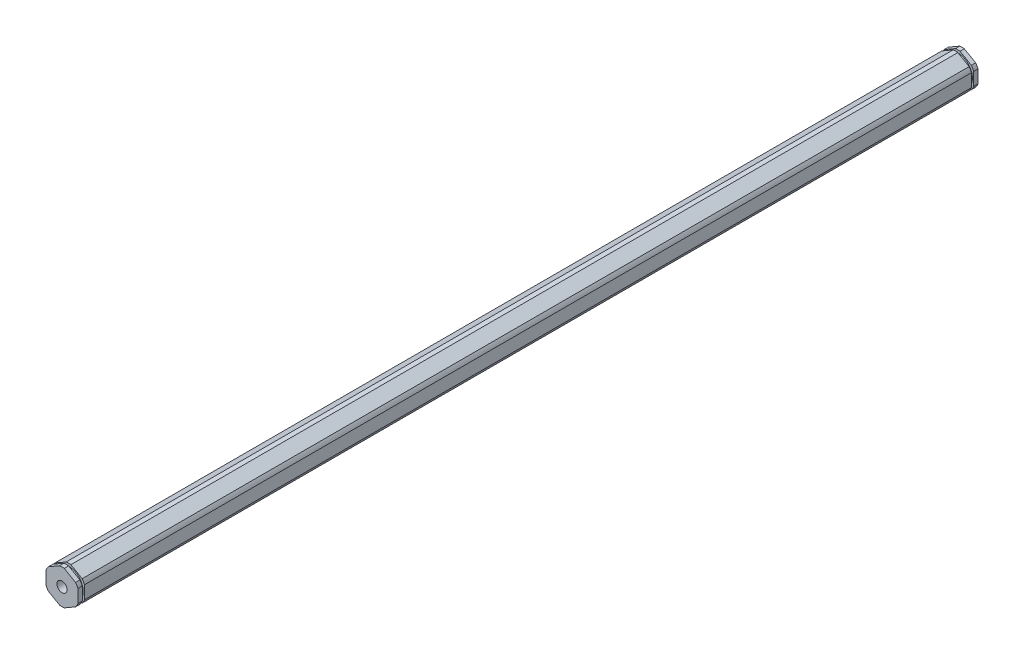
ISO-10303-21;
HEADER;
FILE_DESCRIPTION(('STEP AP214'),'2;1');
FILE_NAME('part.step','',(''),(''),'','','');
FILE_SCHEMA(('AUTOMOTIVE_DESIGN { 1 0 10303 214 1 1 1 1 }'));
ENDSEC;
DATA;
#1=APPLICATION_CONTEXT('core data for automotive mechanical design processes');
#2=APPLICATION_PROTOCOL_DEFINITION('international standard','automotive_design',2000,#1);
#3=PRODUCT_CONTEXT('',#1,'mechanical');
#4=PRODUCT('Part','Part','',(#3));
#5=PRODUCT_RELATED_PRODUCT_CATEGORY('part','',(#4));
#6=PRODUCT_DEFINITION_FORMATION('','',#4);
#7=PRODUCT_DEFINITION_CONTEXT('part definition',#1,'design');
#8=PRODUCT_DEFINITION('design','',#6,#7);
#9=PRODUCT_DEFINITION_SHAPE('','',#8);
#10=(LENGTH_UNIT() NAMED_UNIT(*) SI_UNIT(.MILLI.,.METRE.));
#11=(NAMED_UNIT(*) PLANE_ANGLE_UNIT() SI_UNIT($,.RADIAN.));
#12=(NAMED_UNIT(*) SI_UNIT($,.STERADIAN.) SOLID_ANGLE_UNIT());
#13=UNCERTAINTY_MEASURE_WITH_UNIT(LENGTH_MEASURE(1.E-05),#10,'distance_accuracy_value','');
#14=(GEOMETRIC_REPRESENTATION_CONTEXT(3) GLOBAL_UNCERTAINTY_ASSIGNED_CONTEXT((#13)) GLOBAL_UNIT_ASSIGNED_CONTEXT((#10,
#11,#12)) REPRESENTATION_CONTEXT('',''));
#15=CARTESIAN_POINT('',(0.,0.,0.));
#16=DIRECTION('',(0.,0.,1.));
#17=DIRECTION('',(1.,0.,0.));
#18=AXIS2_PLACEMENT_3D('',#15,#16,#17);
#19=CARTESIAN_POINT('',(0.,0.,178.8795));
#20=DIRECTION('',(0.,0.,-1.));
#21=DIRECTION('',(-1.,0.,0.));
#22=AXIS2_PLACEMENT_3D('',#19,#20,#21);
#23=CYLINDRICAL_SURFACE('',#22,6.858);
#24=CARTESIAN_POINT('',(0.,0.,-176.276));
#25=DIRECTION('',(0.,0.,1.));
#26=DIRECTION('',(1.,0.,0.));
#27=AXIS2_PLACEMENT_3D('',#24,#25,#26);
#28=CIRCLE('',#27,6.858);
#29=CARTESIAN_POINT('',(5.41826726004727,-4.20411035757862,-176.276));
#30=VERTEX_POINT('',#29);
#31=CARTESIAN_POINT('',(6.35,-2.59030191290513,-176.276));
#32=VERTEX_POINT('',#31);
#33=EDGE_CURVE('E323',#30,#32,#28,.T.);
#34=ORIENTED_EDGE('',*,*,#33,.T.);
#35=DIRECTION('',(0.,0.,-1.));
#36=VECTOR('',#35,1.);
#37=CARTESIAN_POINT('',(6.35,-2.59030191290513,178.8795));
#38=LINE('',#37,#36);
#39=CARTESIAN_POINT('',(6.35,-2.59030191290513,176.276));
#40=VERTEX_POINT('',#39);
#41=EDGE_CURVE('E369',#40,#32,#38,.T.);
#42=ORIENTED_EDGE('',*,*,#41,.F.);
#43=CARTESIAN_POINT('',(0.,0.,176.276));
#44=DIRECTION('',(0.,0.,1.));
#45=DIRECTION('',(1.,0.,0.));
#46=AXIS2_PLACEMENT_3D('',#43,#44,#45);
#47=CIRCLE('',#46,6.858);
#48=CARTESIAN_POINT('',(5.41826726004727,-4.20411035757862,176.276));
#49=VERTEX_POINT('',#48);
#50=EDGE_CURVE('E345',#49,#40,#47,.T.);
#51=ORIENTED_EDGE('',*,*,#50,.F.);
#52=DIRECTION('',(0.,0.,-1.));
#53=VECTOR('',#52,1.);
#54=CARTESIAN_POINT('',(5.41826726004727,-4.20411035757862,178.8795));
#55=LINE('',#54,#53);
#56=EDGE_CURVE('E371',#49,#30,#55,.T.);
#57=ORIENTED_EDGE('',*,*,#56,.T.);
#58=EDGE_LOOP('',(#34,#42,#51,#57));
#59=FACE_BOUND('',#58,.T.);
#60=ADVANCED_FACE('F72',(#59),#23,.T.);
#61=CARTESIAN_POINT('',(3.175,-5.49926131403118,178.8795));
#62=DIRECTION('',(-0.5,0.866025403784439,0.));
#63=DIRECTION('',(-0.866025403784439,-0.5,0.));
#64=AXIS2_PLACEMENT_3D('',#61,#62,#63);
#65=PLANE('',#64);
#66=DIRECTION('',(-0.866025403784439,-0.5,0.));
#67=VECTOR('',#66,1.);
#68=CARTESIAN_POINT('',(3.175,-5.49926131403118,-176.276));
#69=LINE('',#68,#67);
#70=CARTESIAN_POINT('',(0.931732739952731,-6.79441227048375,-176.276));
#71=VERTEX_POINT('',#70);
#72=EDGE_CURVE('E641',#30,#71,#69,.T.);
#73=ORIENTED_EDGE('',*,*,#72,.F.);
#74=ORIENTED_EDGE('',*,*,#56,.F.);
#75=DIRECTION('',(0.866025403784439,0.5,0.));
#76=VECTOR('',#75,1.);
#77=CARTESIAN_POINT('',(3.175,-5.49926131403118,176.276));
#78=LINE('',#77,#76);
#79=CARTESIAN_POINT('',(0.931732739952728,-6.79441227048375,176.276));
#80=VERTEX_POINT('',#79);
#81=EDGE_CURVE('E605',#80,#49,#78,.T.);
#82=ORIENTED_EDGE('',*,*,#81,.F.);
#83=DIRECTION('',(0.,0.,-1.));
#84=VECTOR('',#83,1.);
#85=CARTESIAN_POINT('',(0.931732739952731,-6.79441227048375,178.8795));
#86=LINE('',#85,#84);
#87=EDGE_CURVE('E401',#80,#71,#86,.T.);
#88=ORIENTED_EDGE('',*,*,#87,.T.);
#89=EDGE_LOOP('',(#73,#74,#82,#88));
#90=FACE_BOUND('',#89,.T.);
#91=ADVANCED_FACE('F704',(#90),#65,.F.);
#92=CARTESIAN_POINT('',(-0.931732739952719,-6.79441227048375,-176.276));
#93=VERTEX_POINT('',#92);
#94=EDGE_CURVE('E373',#93,#71,#28,.T.);
#95=ORIENTED_EDGE('',*,*,#94,.T.);
#96=ORIENTED_EDGE('',*,*,#87,.F.);
#97=CARTESIAN_POINT('',(0.,0.,176.276));
#98=DIRECTION('',(0.,0.,1.));
#99=DIRECTION('',(1.,0.,0.));
#100=AXIS2_PLACEMENT_3D('',#97,#98,#99);
#101=CIRCLE('',#100,6.858);
#102=CARTESIAN_POINT('',(-0.931732739952721,-6.79441227048375,176.276));
#103=VERTEX_POINT('',#102);
#104=EDGE_CURVE('E620',#103,#80,#101,.T.);
#105=ORIENTED_EDGE('',*,*,#104,.F.);
#106=DIRECTION('',(0.,0.,-1.));
#107=VECTOR('',#106,1.);
#108=CARTESIAN_POINT('',(-0.931732739952721,-6.79441227048375,178.8795));
#109=LINE('',#108,#107);
#110=EDGE_CURVE('E407',#103,#93,#109,.T.);
#111=ORIENTED_EDGE('',*,*,#110,.T.);
#112=EDGE_LOOP('',(#95,#96,#105,#111));
#113=FACE_BOUND('',#112,.T.);
#114=ADVANCED_FACE('F698',(#113),#23,.T.);
#115=CARTESIAN_POINT('',(-3.175,-5.49926131403118,178.8795));
#116=DIRECTION('',(0.5,0.866025403784439,0.));
#117=DIRECTION('',(-0.866025403784439,0.5,0.));
#118=AXIS2_PLACEMENT_3D('',#115,#116,#117);
#119=PLANE('',#118);
#120=DIRECTION('',(-0.866025403784439,0.5,0.));
#121=VECTOR('',#120,1.);
#122=CARTESIAN_POINT('',(-3.175,-5.49926131403118,-176.276));
#123=LINE('',#122,#121);
#124=CARTESIAN_POINT('',(-5.41826726004728,-4.20411035757862,-176.276));
#125=VERTEX_POINT('',#124);
#126=EDGE_CURVE('E644',#93,#125,#123,.T.);
#127=ORIENTED_EDGE('',*,*,#126,.F.);
#128=ORIENTED_EDGE('',*,*,#110,.F.);
#129=DIRECTION('',(0.866025403784439,-0.5,0.));
#130=VECTOR('',#129,1.);
#131=CARTESIAN_POINT('',(-3.175,-5.49926131403118,176.276));
#132=LINE('',#131,#130);
#133=CARTESIAN_POINT('',(-5.41826726004728,-4.20411035757861,176.276));
#134=VERTEX_POINT('',#133);
#135=EDGE_CURVE('E602',#134,#103,#132,.T.);
#136=ORIENTED_EDGE('',*,*,#135,.F.);
#137=DIRECTION('',(0.,0.,-1.));
#138=VECTOR('',#137,1.);
#139=CARTESIAN_POINT('',(-5.41826726004728,-4.20411035757862,178.8795));
#140=LINE('',#139,#138);
#141=EDGE_CURVE('E413',#134,#125,#140,.T.);
#142=ORIENTED_EDGE('',*,*,#141,.T.);
#143=EDGE_LOOP('',(#127,#128,#136,#142));
#144=FACE_BOUND('',#143,.T.);
#145=ADVANCED_FACE('F816',(#144),#119,.F.);
#146=CARTESIAN_POINT('',(-6.35,-2.59030191290514,-176.276));
#147=VERTEX_POINT('',#146);
#148=EDGE_CURVE('E678',#147,#125,#28,.T.);
#149=ORIENTED_EDGE('',*,*,#148,.T.);
#150=ORIENTED_EDGE('',*,*,#141,.F.);
#151=CARTESIAN_POINT('',(-6.35,-2.59030191290514,176.276));
#152=VERTEX_POINT('',#151);
#153=EDGE_CURVE('E805',#152,#134,#101,.T.);
#154=ORIENTED_EDGE('',*,*,#153,.F.);
#155=DIRECTION('',(0.,0.,-1.));
#156=VECTOR('',#155,1.);
#157=CARTESIAN_POINT('',(-6.35,-2.59030191290514,178.8795));
#158=LINE('',#157,#156);
#159=EDGE_CURVE('E419',#152,#147,#158,.T.);
#160=ORIENTED_EDGE('',*,*,#159,.T.);
#161=EDGE_LOOP('',(#149,#150,#154,#160));
#162=FACE_BOUND('',#161,.T.);
#163=ADVANCED_FACE('F821',(#162),#23,.T.);
#164=CARTESIAN_POINT('',(-6.35,0.,178.8795));
#165=DIRECTION('',(1.,0.,0.));
#166=DIRECTION('',(0.,1.,0.));
#167=AXIS2_PLACEMENT_3D('',#164,#165,#166);
#168=PLANE('',#167);
#169=DIRECTION('',(0.,1.,0.));
#170=VECTOR('',#169,1.);
#171=CARTESIAN_POINT('',(-6.35,0.,-176.276));
#172=LINE('',#171,#170);
#173=CARTESIAN_POINT('',(-6.35,2.59030191290514,-176.276));
#174=VERTEX_POINT('',#173);
#175=EDGE_CURVE('E647',#147,#174,#172,.T.);
#176=ORIENTED_EDGE('',*,*,#175,.F.);
#177=ORIENTED_EDGE('',*,*,#159,.F.);
#178=DIRECTION('',(0.,-1.,0.));
#179=VECTOR('',#178,1.);
#180=CARTESIAN_POINT('',(-6.35,0.,176.276));
#181=LINE('',#180,#179);
#182=CARTESIAN_POINT('',(-6.35,2.59030191290514,176.276));
#183=VERTEX_POINT('',#182);
#184=EDGE_CURVE('E599',#183,#152,#181,.T.);
#185=ORIENTED_EDGE('',*,*,#184,.F.);
#186=DIRECTION('',(0.,0.,-1.));
#187=VECTOR('',#186,1.);
#188=CARTESIAN_POINT('',(-6.35,2.59030191290514,178.8795));
#189=LINE('',#188,#187);
#190=EDGE_CURVE('E425',#183,#174,#189,.T.);
#191=ORIENTED_EDGE('',*,*,#190,.T.);
#192=EDGE_LOOP('',(#176,#177,#185,#191));
#193=FACE_BOUND('',#192,.T.);
#194=ADVANCED_FACE('F820',(#193),#168,.F.);
#195=CARTESIAN_POINT('',(-5.41826726004727,4.20411035757862,-176.276));
#196=VERTEX_POINT('',#195);
#197=EDGE_CURVE('E671',#196,#174,#28,.T.);
#198=ORIENTED_EDGE('',*,*,#197,.T.);
#199=ORIENTED_EDGE('',*,*,#190,.F.);
#200=CARTESIAN_POINT('',(-5.41826726004727,4.20411035757862,176.276));
#201=VERTEX_POINT('',#200);
#202=EDGE_CURVE('E802',#201,#183,#101,.T.);
#203=ORIENTED_EDGE('',*,*,#202,.F.);
#204=DIRECTION('',(0.,0.,-1.));
#205=VECTOR('',#204,1.);
#206=CARTESIAN_POINT('',(-5.41826726004727,4.20411035757862,178.8795));
#207=LINE('',#206,#205);
#208=EDGE_CURVE('E431',#201,#196,#207,.T.);
#209=ORIENTED_EDGE('',*,*,#208,.T.);
#210=EDGE_LOOP('',(#198,#199,#203,#209));
#211=FACE_BOUND('',#210,.T.);
#212=ADVANCED_FACE('F830',(#211),#23,.T.);
#213=CARTESIAN_POINT('',(-3.175,5.49926131403119,178.8795));
#214=DIRECTION('',(0.5,-0.866025403784439,0.));
#215=DIRECTION('',(0.866025403784439,0.5,0.));
#216=AXIS2_PLACEMENT_3D('',#213,#214,#215);
#217=PLANE('',#216);
#218=DIRECTION('',(0.866025403784439,0.5,0.));
#219=VECTOR('',#218,1.);
#220=CARTESIAN_POINT('',(-3.175,5.49926131403119,-176.276));
#221=LINE('',#220,#219);
#222=CARTESIAN_POINT('',(-0.931732739952731,6.79441227048375,-176.276));
#223=VERTEX_POINT('',#222);
#224=EDGE_CURVE('E650',#196,#223,#221,.T.);
#225=ORIENTED_EDGE('',*,*,#224,.F.);
#226=ORIENTED_EDGE('',*,*,#208,.F.);
#227=DIRECTION('',(-0.866025403784439,-0.5,0.));
#228=VECTOR('',#227,1.);
#229=CARTESIAN_POINT('',(-3.175,5.49926131403119,176.276));
#230=LINE('',#229,#228);
#231=CARTESIAN_POINT('',(-0.931732739952733,6.79441227048375,176.276));
#232=VERTEX_POINT('',#231);
#233=EDGE_CURVE('E596',#232,#201,#230,.T.);
#234=ORIENTED_EDGE('',*,*,#233,.F.);
#235=DIRECTION('',(0.,0.,-1.));
#236=VECTOR('',#235,1.);
#237=CARTESIAN_POINT('',(-0.931732739952731,6.79441227048375,178.8795));
#238=LINE('',#237,#236);
#239=EDGE_CURVE('E437',#232,#223,#238,.T.);
#240=ORIENTED_EDGE('',*,*,#239,.T.);
#241=EDGE_LOOP('',(#225,#226,#234,#240));
#242=FACE_BOUND('',#241,.T.);
#243=ADVANCED_FACE('F902',(#242),#217,.F.);
#244=CARTESIAN_POINT('',(0.931732739952729,6.79441227048375,-176.276));
#245=VERTEX_POINT('',#244);
#246=EDGE_CURVE('E664',#245,#223,#28,.T.);
#247=ORIENTED_EDGE('',*,*,#246,.T.);
#248=ORIENTED_EDGE('',*,*,#239,.F.);
#249=CARTESIAN_POINT('',(0.931732739952733,6.79441227048375,176.276));
#250=VERTEX_POINT('',#249);
#251=EDGE_CURVE('E619',#250,#232,#101,.T.);
#252=ORIENTED_EDGE('',*,*,#251,.F.);
#253=DIRECTION('',(0.,0.,-1.));
#254=VECTOR('',#253,1.);
#255=CARTESIAN_POINT('',(0.931732739952733,6.79441227048375,178.8795));
#256=LINE('',#255,#254);
#257=EDGE_CURVE('E441',#250,#245,#256,.T.);
#258=ORIENTED_EDGE('',*,*,#257,.T.);
#259=EDGE_LOOP('',(#247,#248,#252,#258));
#260=FACE_BOUND('',#259,.T.);
#261=ADVANCED_FACE('F800',(#260),#23,.T.);
#262=CARTESIAN_POINT('',(3.175,5.49926131403119,178.8795));
#263=DIRECTION('',(-0.5,-0.866025403784439,0.));
#264=DIRECTION('',(0.866025403784439,-0.5,0.));
#265=AXIS2_PLACEMENT_3D('',#262,#263,#264);
#266=PLANE('',#265);
#267=DIRECTION('',(0.866025403784439,-0.5,0.));
#268=VECTOR('',#267,1.);
#269=CARTESIAN_POINT('',(3.175,5.49926131403119,-176.276));
#270=LINE('',#269,#268);
#271=CARTESIAN_POINT('',(5.41826726004727,4.20411035757862,-176.276));
#272=VERTEX_POINT('',#271);
#273=EDGE_CURVE('E653',#245,#272,#270,.T.);
#274=ORIENTED_EDGE('',*,*,#273,.F.);
#275=ORIENTED_EDGE('',*,*,#257,.F.);
#276=DIRECTION('',(-0.866025403784439,0.5,0.));
#277=VECTOR('',#276,1.);
#278=CARTESIAN_POINT('',(3.175,5.49926131403119,176.276));
#279=LINE('',#278,#277);
#280=CARTESIAN_POINT('',(5.41826726004727,4.20411035757862,176.276));
#281=VERTEX_POINT('',#280);
#282=EDGE_CURVE('E593',#281,#250,#279,.T.);
#283=ORIENTED_EDGE('',*,*,#282,.F.);
#284=DIRECTION('',(0.,0.,-1.));
#285=VECTOR('',#284,1.);
#286=CARTESIAN_POINT('',(5.41826726004727,4.20411035757862,178.8795));
#287=LINE('',#286,#285);
#288=EDGE_CURVE('E340',#281,#272,#287,.T.);
#289=ORIENTED_EDGE('',*,*,#288,.T.);
#290=EDGE_LOOP('',(#274,#275,#283,#289));
#291=FACE_BOUND('',#290,.T.);
#292=ADVANCED_FACE('F793',(#291),#266,.F.);
#293=CARTESIAN_POINT('',(6.35,2.59030191290513,-176.276));
#294=VERTEX_POINT('',#293);
#295=EDGE_CURVE('E88',#294,#272,#28,.T.);
#296=ORIENTED_EDGE('',*,*,#295,.T.);
#297=ORIENTED_EDGE('',*,*,#288,.F.);
#298=CARTESIAN_POINT('',(6.35,2.59030191290513,176.276));
#299=VERTEX_POINT('',#298);
#300=EDGE_CURVE('E616',#299,#281,#101,.T.);
#301=ORIENTED_EDGE('',*,*,#300,.F.);
#302=DIRECTION('',(0.,0.,-1.));
#303=VECTOR('',#302,1.);
#304=CARTESIAN_POINT('',(6.35,2.59030191290513,178.8795));
#305=LINE('',#304,#303);
#306=EDGE_CURVE('E331',#299,#294,#305,.T.);
#307=ORIENTED_EDGE('',*,*,#306,.T.);
#308=EDGE_LOOP('',(#296,#297,#301,#307));
#309=FACE_BOUND('',#308,.T.);
#310=ADVANCED_FACE('F796',(#309),#23,.T.);
#311=CARTESIAN_POINT('',(6.35,0.,178.8795));
#312=DIRECTION('',(-1.,0.,0.));
#313=DIRECTION('',(0.,-1.,0.));
#314=AXIS2_PLACEMENT_3D('',#311,#312,#313);
#315=PLANE('',#314);
#316=DIRECTION('',(0.,-1.,0.));
#317=VECTOR('',#316,1.);
#318=CARTESIAN_POINT('',(6.35,0.,-176.276));
#319=LINE('',#318,#317);
#320=EDGE_CURVE('E81',#294,#32,#319,.T.);
#321=ORIENTED_EDGE('',*,*,#320,.F.);
#322=ORIENTED_EDGE('',*,*,#306,.F.);
#323=DIRECTION('',(0.,1.,0.));
#324=VECTOR('',#323,1.);
#325=CARTESIAN_POINT('',(6.35,0.,176.276));
#326=LINE('',#325,#324);
#327=EDGE_CURVE('E376',#40,#299,#326,.T.);
#328=ORIENTED_EDGE('',*,*,#327,.F.);
#329=ORIENTED_EDGE('',*,*,#41,.T.);
#330=EDGE_LOOP('',(#321,#322,#328,#329));
#331=FACE_BOUND('',#330,.T.);
#332=ADVANCED_FACE('F375',(#331),#315,.F.);
#333=DIRECTION('',(0.,-1.,0.));
#334=VECTOR('',#333,1.);
#335=CARTESIAN_POINT('',(6.35,0.,177.165));
#336=LINE('',#335,#334);
#337=CARTESIAN_POINT('',(6.35,2.59030191290513,177.165));
#338=VERTEX_POINT('',#337);
#339=CARTESIAN_POINT('',(6.35,-2.59030191290513,177.165));
#340=VERTEX_POINT('',#339);
#341=EDGE_CURVE('E573',#338,#340,#336,.T.);
#342=ORIENTED_EDGE('',*,*,#341,.F.);
#343=CARTESIAN_POINT('',(6.35,2.59030191290513,178.8795));
#344=VERTEX_POINT('',#343);
#345=EDGE_CURVE('E334',#344,#338,#305,.T.);
#346=ORIENTED_EDGE('',*,*,#345,.F.);
#347=DIRECTION('',(0.,1.,0.));
#348=VECTOR('',#347,1.);
#349=CARTESIAN_POINT('',(6.35,0.,178.8795));
#350=LINE('',#349,#348);
#351=CARTESIAN_POINT('',(6.35,-2.59030191290513,178.8795));
#352=VERTEX_POINT('',#351);
#353=EDGE_CURVE('E516',#352,#344,#350,.T.);
#354=ORIENTED_EDGE('',*,*,#353,.F.);
#355=EDGE_CURVE('E378',#352,#340,#38,.T.);
#356=ORIENTED_EDGE('',*,*,#355,.T.);
#357=EDGE_LOOP('',(#342,#346,#354,#356));
#358=FACE_BOUND('',#357,.T.);
#359=ADVANCED_FACE('F74',(#358),#315,.F.);
#360=CARTESIAN_POINT('',(0.,0.,177.165));
#361=DIRECTION('',(0.,0.,1.));
#362=DIRECTION('',(1.,0.,0.));
#363=AXIS2_PLACEMENT_3D('',#360,#361,#362);
#364=CIRCLE('',#363,6.858);
#365=CARTESIAN_POINT('',(5.41826726004727,4.20411035757862,177.165));
#366=VERTEX_POINT('',#365);
#367=EDGE_CURVE('E621',#338,#366,#364,.T.);
#368=ORIENTED_EDGE('',*,*,#367,.T.);
#369=CARTESIAN_POINT('',(5.41826726004727,4.20411035757862,178.8795));
#370=VERTEX_POINT('',#369);
#371=EDGE_CURVE('E332',#370,#366,#287,.T.);
#372=ORIENTED_EDGE('',*,*,#371,.F.);
#373=CARTESIAN_POINT('',(0.,0.,178.8795));
#374=DIRECTION('',(0.,0.,1.));
#375=DIRECTION('',(1.,0.,0.));
#376=AXIS2_PLACEMENT_3D('',#373,#374,#375);
#377=CIRCLE('',#376,6.858);
#378=EDGE_CURVE('E522',#344,#370,#377,.T.);
#379=ORIENTED_EDGE('',*,*,#378,.F.);
#380=ORIENTED_EDGE('',*,*,#345,.T.);
#381=EDGE_LOOP('',(#368,#372,#379,#380));
#382=FACE_BOUND('',#381,.T.);
#383=ADVANCED_FACE('F836',(#382),#23,.T.);
#384=DIRECTION('',(0.866025403784439,-0.5,0.));
#385=VECTOR('',#384,1.);
#386=CARTESIAN_POINT('',(3.175,5.49926131403119,177.165));
#387=LINE('',#386,#385);
#388=CARTESIAN_POINT('',(0.931732739952733,6.79441227048375,177.165));
#389=VERTEX_POINT('',#388);
#390=EDGE_CURVE('E576',#389,#366,#387,.T.);
#391=ORIENTED_EDGE('',*,*,#390,.F.);
#392=CARTESIAN_POINT('',(0.931732739952733,6.79441227048375,178.8795));
#393=VERTEX_POINT('',#392);
#394=EDGE_CURVE('E438',#393,#389,#256,.T.);
#395=ORIENTED_EDGE('',*,*,#394,.F.);
#396=DIRECTION('',(-0.866025403784439,0.5,0.));
#397=VECTOR('',#396,1.);
#398=CARTESIAN_POINT('',(3.175,5.49926131403119,178.8795));
#399=LINE('',#398,#397);
#400=EDGE_CURVE('E528',#370,#393,#399,.T.);
#401=ORIENTED_EDGE('',*,*,#400,.F.);
#402=ORIENTED_EDGE('',*,*,#371,.T.);
#403=EDGE_LOOP('',(#391,#395,#401,#402));
#404=FACE_BOUND('',#403,.T.);
#405=ADVANCED_FACE('F855',(#404),#266,.F.);
#406=CARTESIAN_POINT('',(-0.931732739952733,6.79441227048375,177.165));
#407=VERTEX_POINT('',#406);
#408=EDGE_CURVE('E624',#389,#407,#364,.T.);
#409=ORIENTED_EDGE('',*,*,#408,.T.);
#410=CARTESIAN_POINT('',(-0.931732739952731,6.79441227048375,178.8795));
#411=VERTEX_POINT('',#410);
#412=EDGE_CURVE('E432',#411,#407,#238,.T.);
#413=ORIENTED_EDGE('',*,*,#412,.F.);
#414=EDGE_CURVE('E530',#393,#411,#377,.T.);
#415=ORIENTED_EDGE('',*,*,#414,.F.);
#416=ORIENTED_EDGE('',*,*,#394,.T.);
#417=EDGE_LOOP('',(#409,#413,#415,#416));
#418=FACE_BOUND('',#417,.T.);
#419=ADVANCED_FACE('F861',(#418),#23,.T.);
#420=DIRECTION('',(0.866025403784439,0.5,0.));
#421=VECTOR('',#420,1.);
#422=CARTESIAN_POINT('',(-3.175,5.49926131403119,177.165));
#423=LINE('',#422,#421);
#424=CARTESIAN_POINT('',(-5.41826726004727,4.20411035757862,177.165));
#425=VERTEX_POINT('',#424);
#426=EDGE_CURVE('E579',#425,#407,#423,.T.);
#427=ORIENTED_EDGE('',*,*,#426,.F.);
#428=CARTESIAN_POINT('',(-5.41826726004727,4.20411035757862,178.8795));
#429=VERTEX_POINT('',#428);
#430=EDGE_CURVE('E426',#429,#425,#207,.T.);
#431=ORIENTED_EDGE('',*,*,#430,.F.);
#432=DIRECTION('',(-0.866025403784439,-0.5,0.));
#433=VECTOR('',#432,1.);
#434=CARTESIAN_POINT('',(-3.175,5.49926131403119,178.8795));
#435=LINE('',#434,#433);
#436=EDGE_CURVE('E537',#411,#429,#435,.T.);
#437=ORIENTED_EDGE('',*,*,#436,.F.);
#438=ORIENTED_EDGE('',*,*,#412,.T.);
#439=EDGE_LOOP('',(#427,#431,#437,#438));
#440=FACE_BOUND('',#439,.T.);
#441=ADVANCED_FACE('F895',(#440),#217,.F.);
#442=CARTESIAN_POINT('',(-6.35,2.59030191290514,177.165));
#443=VERTEX_POINT('',#442);
#444=EDGE_CURVE('E1251',#425,#443,#364,.T.);
#445=ORIENTED_EDGE('',*,*,#444,.T.);
#446=CARTESIAN_POINT('',(-6.35,2.59030191290514,178.8795));
#447=VERTEX_POINT('',#446);
#448=EDGE_CURVE('E420',#447,#443,#189,.T.);
#449=ORIENTED_EDGE('',*,*,#448,.F.);
#450=EDGE_CURVE('E540',#429,#447,#377,.T.);
#451=ORIENTED_EDGE('',*,*,#450,.F.);
#452=ORIENTED_EDGE('',*,*,#430,.T.);
#453=EDGE_LOOP('',(#445,#449,#451,#452));
#454=FACE_BOUND('',#453,.T.);
#455=ADVANCED_FACE('F888',(#454),#23,.T.);
#456=DIRECTION('',(0.,1.,0.));
#457=VECTOR('',#456,1.);
#458=CARTESIAN_POINT('',(-6.35,0.,177.165));
#459=LINE('',#458,#457);
#460=CARTESIAN_POINT('',(-6.35,-2.59030191290514,177.165));
#461=VERTEX_POINT('',#460);
#462=EDGE_CURVE('E582',#461,#443,#459,.T.);
#463=ORIENTED_EDGE('',*,*,#462,.F.);
#464=CARTESIAN_POINT('',(-6.35,-2.59030191290514,178.8795));
#465=VERTEX_POINT('',#464);
#466=EDGE_CURVE('E414',#465,#461,#158,.T.);
#467=ORIENTED_EDGE('',*,*,#466,.F.);
#468=DIRECTION('',(0.,-1.,0.));
#469=VECTOR('',#468,1.);
#470=CARTESIAN_POINT('',(-6.35,0.,178.8795));
#471=LINE('',#470,#469);
#472=EDGE_CURVE('E541',#447,#465,#471,.T.);
#473=ORIENTED_EDGE('',*,*,#472,.F.);
#474=ORIENTED_EDGE('',*,*,#448,.T.);
#475=EDGE_LOOP('',(#463,#467,#473,#474));
#476=FACE_BOUND('',#475,.T.);
#477=ADVANCED_FACE('F832',(#476),#168,.F.);
#478=CARTESIAN_POINT('',(-5.41826726004728,-4.20411035757861,177.165));
#479=VERTEX_POINT('',#478);
#480=EDGE_CURVE('E1248',#461,#479,#364,.T.);
#481=ORIENTED_EDGE('',*,*,#480,.T.);
#482=CARTESIAN_POINT('',(-5.41826726004728,-4.20411035757862,178.8795));
#483=VERTEX_POINT('',#482);
#484=EDGE_CURVE('E408',#483,#479,#140,.T.);
#485=ORIENTED_EDGE('',*,*,#484,.F.);
#486=EDGE_CURVE('E544',#465,#483,#377,.T.);
#487=ORIENTED_EDGE('',*,*,#486,.F.);
#488=ORIENTED_EDGE('',*,*,#466,.T.);
#489=EDGE_LOOP('',(#481,#485,#487,#488));
#490=FACE_BOUND('',#489,.T.);
#491=ADVANCED_FACE('F880',(#490),#23,.T.);
#492=DIRECTION('',(-0.866025403784439,0.5,0.));
#493=VECTOR('',#492,1.);
#494=CARTESIAN_POINT('',(-3.175,-5.49926131403118,177.165));
#495=LINE('',#494,#493);
#496=CARTESIAN_POINT('',(-0.931732739952721,-6.79441227048375,177.165));
#497=VERTEX_POINT('',#496);
#498=EDGE_CURVE('E585',#497,#479,#495,.T.);
#499=ORIENTED_EDGE('',*,*,#498,.F.);
#500=CARTESIAN_POINT('',(-0.931732739952721,-6.79441227048375,178.8795));
#501=VERTEX_POINT('',#500);
#502=EDGE_CURVE('E402',#501,#497,#109,.T.);
#503=ORIENTED_EDGE('',*,*,#502,.F.);
#504=DIRECTION('',(0.866025403784439,-0.5,0.));
#505=VECTOR('',#504,1.);
#506=CARTESIAN_POINT('',(-3.175,-5.49926131403118,178.8795));
#507=LINE('',#506,#505);
#508=EDGE_CURVE('E545',#483,#501,#507,.T.);
#509=ORIENTED_EDGE('',*,*,#508,.F.);
#510=ORIENTED_EDGE('',*,*,#484,.T.);
#511=EDGE_LOOP('',(#499,#503,#509,#510));
#512=FACE_BOUND('',#511,.T.);
#513=ADVANCED_FACE('F835',(#512),#119,.F.);
#514=CARTESIAN_POINT('',(0.931732739952728,-6.79441227048375,177.165));
#515=VERTEX_POINT('',#514);
#516=EDGE_CURVE('E625',#497,#515,#364,.T.);
#517=ORIENTED_EDGE('',*,*,#516,.T.);
#518=CARTESIAN_POINT('',(0.931732739952731,-6.79441227048375,178.8795));
#519=VERTEX_POINT('',#518);
#520=EDGE_CURVE('E396',#519,#515,#86,.T.);
#521=ORIENTED_EDGE('',*,*,#520,.F.);
#522=EDGE_CURVE('E548',#501,#519,#377,.T.);
#523=ORIENTED_EDGE('',*,*,#522,.F.);
#524=ORIENTED_EDGE('',*,*,#502,.T.);
#525=EDGE_LOOP('',(#517,#521,#523,#524));
#526=FACE_BOUND('',#525,.T.);
#527=ADVANCED_FACE('F867',(#526),#23,.T.);
#528=DIRECTION('',(-0.866025403784439,-0.5,0.));
#529=VECTOR('',#528,1.);
#530=CARTESIAN_POINT('',(3.175,-5.49926131403118,177.165));
#531=LINE('',#530,#529);
#532=CARTESIAN_POINT('',(5.41826726004727,-4.20411035757862,177.165));
#533=VERTEX_POINT('',#532);
#534=EDGE_CURVE('E588',#533,#515,#531,.T.);
#535=ORIENTED_EDGE('',*,*,#534,.F.);
#536=CARTESIAN_POINT('',(5.41826726004727,-4.20411035757862,178.8795));
#537=VERTEX_POINT('',#536);
#538=EDGE_CURVE('E391',#537,#533,#55,.T.);
#539=ORIENTED_EDGE('',*,*,#538,.F.);
#540=DIRECTION('',(0.866025403784439,0.5,0.));
#541=VECTOR('',#540,1.);
#542=CARTESIAN_POINT('',(3.175,-5.49926131403118,178.8795));
#543=LINE('',#542,#541);
#544=EDGE_CURVE('E549',#519,#537,#543,.T.);
#545=ORIENTED_EDGE('',*,*,#544,.F.);
#546=ORIENTED_EDGE('',*,*,#520,.T.);
#547=EDGE_LOOP('',(#535,#539,#545,#546));
#548=FACE_BOUND('',#547,.T.);
#549=ADVANCED_FACE('F848',(#548),#65,.F.);
#550=CARTESIAN_POINT('',(0.,0.,177.165));
#551=DIRECTION('',(0.,0.,-1.));
#552=DIRECTION('',(-1.,0.,0.));
#553=AXIS2_PLACEMENT_3D('',#550,#551,#552);
#554=CIRCLE('',#553,6.858);
#555=EDGE_CURVE('E351',#340,#533,#554,.T.);
#556=ORIENTED_EDGE('',*,*,#555,.F.);
#557=ORIENTED_EDGE('',*,*,#355,.F.);
#558=EDGE_CURVE('E386',#537,#352,#377,.T.);
#559=ORIENTED_EDGE('',*,*,#558,.F.);
#560=ORIENTED_EDGE('',*,*,#538,.T.);
#561=EDGE_LOOP('',(#556,#557,#559,#560));
#562=FACE_BOUND('',#561,.T.);
#563=ADVANCED_FACE('F856',(#562),#23,.T.);
#564=CARTESIAN_POINT('',(0.,0.,178.8795));
#565=DIRECTION('',(0.,0.,1.));
#566=DIRECTION('',(1.,0.,0.));
#567=AXIS2_PLACEMENT_3D('',#564,#565,#566);
#568=PLANE('',#567);
#569=CARTESIAN_POINT('',(0.,0.,178.8795));
#570=DIRECTION('',(0.,0.,1.));
#571=DIRECTION('',(1.,0.,0.));
#572=AXIS2_PLACEMENT_3D('',#569,#570,#571);
#573=CIRCLE('',#572,2.01929999999999);
#574=CARTESIAN_POINT('',(2.01929999999999,0.,178.8795));
#575=VERTEX_POINT('',#574);
#576=EDGE_CURVE('E567',#575,#575,#573,.T.);
#577=ORIENTED_EDGE('',*,*,#576,.F.);
#578=EDGE_LOOP('',(#577));
#579=FACE_BOUND('',#578,.T.);
#580=ORIENTED_EDGE('',*,*,#353,.T.);
#581=ORIENTED_EDGE('',*,*,#378,.T.);
#582=ORIENTED_EDGE('',*,*,#400,.T.);
#583=ORIENTED_EDGE('',*,*,#414,.T.);
#584=ORIENTED_EDGE('',*,*,#436,.T.);
#585=ORIENTED_EDGE('',*,*,#450,.T.);
#586=ORIENTED_EDGE('',*,*,#472,.T.);
#587=ORIENTED_EDGE('',*,*,#486,.T.);
#588=ORIENTED_EDGE('',*,*,#508,.T.);
#589=ORIENTED_EDGE('',*,*,#522,.T.);
#590=ORIENTED_EDGE('',*,*,#544,.T.);
#591=ORIENTED_EDGE('',*,*,#558,.T.);
#592=EDGE_LOOP('',(#580,#581,#582,#583,#584,#585,#586,#587,#588,#589,#590,#591));
#593=FACE_BOUND('',#592,.T.);
#594=ADVANCED_FACE('F865',(#579,#593),#568,.T.);
#595=CARTESIAN_POINT('',(0.,0.,162.53206));
#596=DIRECTION('',(0.,0.,1.));
#597=DIRECTION('',(1.,0.,0.));
#598=AXIS2_PLACEMENT_3D('',#595,#596,#597);
#599=CONICAL_SURFACE('',#598,2.01929999999999,1.02974425867665);
#600=CARTESIAN_POINT('',(0.,0.,161.318742151998));
#601=VERTEX_POINT('',#600);
#602=VERTEX_LOOP('',#601);
#603=FACE_BOUND('',#602,.T.);
#604=CARTESIAN_POINT('',(0.,0.,162.53206));
#605=DIRECTION('',(0.,0.,1.));
#606=DIRECTION('',(1.,0.,0.));
#607=AXIS2_PLACEMENT_3D('',#604,#605,#606);
#608=CIRCLE('',#607,2.01929999999999);
#609=CARTESIAN_POINT('',(2.01929999999999,0.,162.53206));
#610=VERTEX_POINT('',#609);
#611=EDGE_CURVE('E561',#610,#610,#608,.T.);
#612=ORIENTED_EDGE('',*,*,#611,.T.);
#613=EDGE_LOOP('',(#612));
#614=FACE_BOUND('',#613,.T.);
#615=ADVANCED_FACE('F873',(#603,#614),#599,.F.);
#616=CARTESIAN_POINT('',(0.,0.,178.8795));
#617=DIRECTION('',(0.,0.,1.));
#618=DIRECTION('',(1.,0.,0.));
#619=AXIS2_PLACEMENT_3D('',#616,#617,#618);
#620=CYLINDRICAL_SURFACE('',#619,2.01929999999999);
#621=ORIENTED_EDGE('',*,*,#611,.F.);
#622=EDGE_LOOP('',(#621));
#623=FACE_BOUND('',#622,.T.);
#624=ORIENTED_EDGE('',*,*,#576,.T.);
#625=EDGE_LOOP('',(#624));
#626=FACE_BOUND('',#625,.T.);
#627=ADVANCED_FACE('F1088',(#623,#626),#620,.F.);
#628=CARTESIAN_POINT('',(0.,6.858,177.165));
#629=DIRECTION('',(0.,0.,-1.));
#630=DIRECTION('',(-1.,0.,0.));
#631=AXIS2_PLACEMENT_3D('',#628,#629,#630);
#632=PLANE('',#631);
#633=CARTESIAN_POINT('',(0.,0.,177.165));
#634=DIRECTION('',(0.,0.,1.));
#635=DIRECTION('',(1.,0.,0.));
#636=AXIS2_PLACEMENT_3D('',#633,#634,#635);
#637=CIRCLE('',#636,5.8547);
#638=CARTESIAN_POINT('',(5.8547,0.,177.165));
#639=VERTEX_POINT('',#638);
#640=EDGE_CURVE('E608',#639,#639,#637,.T.);
#641=ORIENTED_EDGE('',*,*,#640,.T.);
#642=EDGE_LOOP('',(#641));
#643=FACE_BOUND('',#642,.T.);
#644=ORIENTED_EDGE('',*,*,#341,.T.);
#645=ORIENTED_EDGE('',*,*,#555,.T.);
#646=ORIENTED_EDGE('',*,*,#534,.T.);
#647=ORIENTED_EDGE('',*,*,#516,.F.);
#648=ORIENTED_EDGE('',*,*,#498,.T.);
#649=ORIENTED_EDGE('',*,*,#480,.F.);
#650=ORIENTED_EDGE('',*,*,#462,.T.);
#651=ORIENTED_EDGE('',*,*,#444,.F.);
#652=ORIENTED_EDGE('',*,*,#426,.T.);
#653=ORIENTED_EDGE('',*,*,#408,.F.);
#654=ORIENTED_EDGE('',*,*,#390,.T.);
#655=ORIENTED_EDGE('',*,*,#367,.F.);
#656=EDGE_LOOP('',(#644,#645,#646,#647,#648,#649,#650,#651,#652,#653,#654,#655));
#657=FACE_BOUND('',#656,.T.);
#658=ADVANCED_FACE('F1079',(#643,#657),#632,.T.);
#659=CARTESIAN_POINT('',(0.,6.858,176.276));
#660=DIRECTION('',(0.,0.,1.));
#661=DIRECTION('',(1.,0.,0.));
#662=AXIS2_PLACEMENT_3D('',#659,#660,#661);
#663=PLANE('',#662);
#664=CARTESIAN_POINT('',(0.,0.,176.276));
#665=DIRECTION('',(0.,0.,1.));
#666=DIRECTION('',(1.,0.,0.));
#667=AXIS2_PLACEMENT_3D('',#664,#665,#666);
#668=CIRCLE('',#667,5.8547);
#669=CARTESIAN_POINT('',(5.8547,0.,176.276));
#670=VERTEX_POINT('',#669);
#671=EDGE_CURVE('E612',#670,#670,#668,.T.);
#672=ORIENTED_EDGE('',*,*,#671,.F.);
#673=EDGE_LOOP('',(#672));
#674=FACE_BOUND('',#673,.T.);
#675=ORIENTED_EDGE('',*,*,#327,.T.);
#676=ORIENTED_EDGE('',*,*,#300,.T.);
#677=ORIENTED_EDGE('',*,*,#282,.T.);
#678=ORIENTED_EDGE('',*,*,#251,.T.);
#679=ORIENTED_EDGE('',*,*,#233,.T.);
#680=ORIENTED_EDGE('',*,*,#202,.T.);
#681=ORIENTED_EDGE('',*,*,#184,.T.);
#682=ORIENTED_EDGE('',*,*,#153,.T.);
#683=ORIENTED_EDGE('',*,*,#135,.T.);
#684=ORIENTED_EDGE('',*,*,#104,.T.);
#685=ORIENTED_EDGE('',*,*,#81,.T.);
#686=ORIENTED_EDGE('',*,*,#50,.T.);
#687=EDGE_LOOP('',(#675,#676,#677,#678,#679,#680,#681,#682,#683,#684,#685,#686));
#688=FACE_BOUND('',#687,.T.);
#689=ADVANCED_FACE('F797',(#674,#688),#663,.T.);
#690=CARTESIAN_POINT('',(0.,0.,165.047176272324));
#691=DIRECTION('',(0.,0.,1.));
#692=DIRECTION('',(1.,0.,0.));
#693=AXIS2_PLACEMENT_3D('',#690,#691,#692);
#694=CYLINDRICAL_SURFACE('',#693,5.8547);
#695=ORIENTED_EDGE('',*,*,#671,.T.);
#696=EDGE_LOOP('',(#695));
#697=FACE_BOUND('',#696,.T.);
#698=ORIENTED_EDGE('',*,*,#640,.F.);
#699=EDGE_LOOP('',(#698));
#700=FACE_BOUND('',#699,.T.);
#701=ADVANCED_FACE('F1004',(#697,#700),#694,.T.);
#702=CARTESIAN_POINT('',(0.,6.858,-177.165));
#703=DIRECTION('',(0.,0.,1.));
#704=DIRECTION('',(-1.,0.,0.));
#705=AXIS2_PLACEMENT_3D('',#702,#703,#704);
#706=PLANE('',#705);
#707=CARTESIAN_POINT('',(0.,0.,-177.165));
#708=DIRECTION('',(0.,0.,1.));
#709=DIRECTION('',(1.,0.,0.));
#710=AXIS2_PLACEMENT_3D('',#707,#708,#709);
#711=CIRCLE('',#710,5.8547);
#712=CARTESIAN_POINT('',(5.8547,0.,-177.165));
#713=VERTEX_POINT('',#712);
#714=EDGE_CURVE('E656',#713,#713,#711,.T.);
#715=ORIENTED_EDGE('',*,*,#714,.F.);
#716=EDGE_LOOP('',(#715));
#717=FACE_BOUND('',#716,.T.);
#718=DIRECTION('',(0.866025403784439,0.5,0.));
#719=VECTOR('',#718,1.);
#720=CARTESIAN_POINT('',(3.175,-5.49926131403118,-177.165));
#721=LINE('',#720,#719);
#722=CARTESIAN_POINT('',(0.931732739952731,-6.79441227048375,-177.165));
#723=VERTEX_POINT('',#722);
#724=CARTESIAN_POINT('',(5.41826726004727,-4.20411035757862,-177.165));
#725=VERTEX_POINT('',#724);
#726=EDGE_CURVE('E626',#723,#725,#721,.T.);
#727=ORIENTED_EDGE('',*,*,#726,.T.);
#728=CARTESIAN_POINT('',(0.,0.,-177.165));
#729=DIRECTION('',(0.,0.,1.));
#730=DIRECTION('',(1.,0.,0.));
#731=AXIS2_PLACEMENT_3D('',#728,#729,#730);
#732=CIRCLE('',#731,6.858);
#733=CARTESIAN_POINT('',(6.35,-2.59030191290513,-177.165));
#734=VERTEX_POINT('',#733);
#735=EDGE_CURVE('E95',#725,#734,#732,.T.);
#736=ORIENTED_EDGE('',*,*,#735,.T.);
#737=DIRECTION('',(0.,1.,0.));
#738=VECTOR('',#737,1.);
#739=CARTESIAN_POINT('',(6.35,0.,-177.165));
#740=LINE('',#739,#738);
#741=CARTESIAN_POINT('',(6.35,2.59030191290513,-177.165));
#742=VERTEX_POINT('',#741);
#743=EDGE_CURVE('E13',#734,#742,#740,.T.);
#744=ORIENTED_EDGE('',*,*,#743,.T.);
#745=CARTESIAN_POINT('',(5.41826726004727,4.20411035757862,-177.165));
#746=VERTEX_POINT('',#745);
#747=EDGE_CURVE('E310',#742,#746,#732,.T.);
#748=ORIENTED_EDGE('',*,*,#747,.T.);
#749=DIRECTION('',(-0.866025403784439,0.5,0.));
#750=VECTOR('',#749,1.);
#751=CARTESIAN_POINT('',(3.175,5.49926131403119,-177.165));
#752=LINE('',#751,#750);
#753=CARTESIAN_POINT('',(0.931732739952729,6.79441227048375,-177.165));
#754=VERTEX_POINT('',#753);
#755=EDGE_CURVE('E638',#746,#754,#752,.T.);
#756=ORIENTED_EDGE('',*,*,#755,.T.);
#757=CARTESIAN_POINT('',(-0.931732739952731,6.79441227048375,-177.165));
#758=VERTEX_POINT('',#757);
#759=EDGE_CURVE('E324',#754,#758,#732,.T.);
#760=ORIENTED_EDGE('',*,*,#759,.T.);
#761=DIRECTION('',(-0.866025403784439,-0.5,0.));
#762=VECTOR('',#761,1.);
#763=CARTESIAN_POINT('',(-3.175,5.49926131403119,-177.165));
#764=LINE('',#763,#762);
#765=CARTESIAN_POINT('',(-5.41826726004727,4.20411035757862,-177.165));
#766=VERTEX_POINT('',#765);
#767=EDGE_CURVE('E635',#758,#766,#764,.T.);
#768=ORIENTED_EDGE('',*,*,#767,.T.);
#769=CARTESIAN_POINT('',(-6.35,2.59030191290514,-177.165));
#770=VERTEX_POINT('',#769);
#771=EDGE_CURVE('E1397',#766,#770,#732,.T.);
#772=ORIENTED_EDGE('',*,*,#771,.T.);
#773=DIRECTION('',(0.,-1.,0.));
#774=VECTOR('',#773,1.);
#775=CARTESIAN_POINT('',(-6.35,0.,-177.165));
#776=LINE('',#775,#774);
#777=CARTESIAN_POINT('',(-6.35,-2.59030191290514,-177.165));
#778=VERTEX_POINT('',#777);
#779=EDGE_CURVE('E632',#770,#778,#776,.T.);
#780=ORIENTED_EDGE('',*,*,#779,.T.);
#781=CARTESIAN_POINT('',(-5.41826726004728,-4.20411035757862,-177.165));
#782=VERTEX_POINT('',#781);
#783=EDGE_CURVE('E718',#778,#782,#732,.T.);
#784=ORIENTED_EDGE('',*,*,#783,.T.);
#785=DIRECTION('',(0.866025403784439,-0.5,0.));
#786=VECTOR('',#785,1.);
#787=CARTESIAN_POINT('',(-3.175,-5.49926131403118,-177.165));
#788=LINE('',#787,#786);
#789=CARTESIAN_POINT('',(-0.931732739952719,-6.79441227048375,-177.165));
#790=VERTEX_POINT('',#789);
#791=EDGE_CURVE('E629',#782,#790,#788,.T.);
#792=ORIENTED_EDGE('',*,*,#791,.T.);
#793=EDGE_CURVE('E715',#790,#723,#732,.T.);
#794=ORIENTED_EDGE('',*,*,#793,.T.);
#795=EDGE_LOOP('',(#727,#736,#744,#748,#756,#760,#768,#772,#780,#784,#792,#794));
#796=FACE_BOUND('',#795,.T.);
#797=ADVANCED_FACE('F309',(#717,#796),#706,.T.);
#798=CARTESIAN_POINT('',(0.,6.858,-176.276));
#799=DIRECTION('',(0.,0.,-1.));
#800=DIRECTION('',(1.,0.,0.));
#801=AXIS2_PLACEMENT_3D('',#798,#799,#800);
#802=PLANE('',#801);
#803=CARTESIAN_POINT('',(0.,0.,-176.276));
#804=DIRECTION('',(0.,0.,1.));
#805=DIRECTION('',(1.,0.,0.));
#806=AXIS2_PLACEMENT_3D('',#803,#804,#805);
#807=CIRCLE('',#806,5.8547);
#808=CARTESIAN_POINT('',(5.8547,0.,-176.276));
#809=VERTEX_POINT('',#808);
#810=EDGE_CURVE('E660',#809,#809,#807,.T.);
#811=ORIENTED_EDGE('',*,*,#810,.T.);
#812=EDGE_LOOP('',(#811));
#813=FACE_BOUND('',#812,.T.);
#814=ORIENTED_EDGE('',*,*,#72,.T.);
#815=ORIENTED_EDGE('',*,*,#94,.F.);
#816=ORIENTED_EDGE('',*,*,#126,.T.);
#817=ORIENTED_EDGE('',*,*,#148,.F.);
#818=ORIENTED_EDGE('',*,*,#175,.T.);
#819=ORIENTED_EDGE('',*,*,#197,.F.);
#820=ORIENTED_EDGE('',*,*,#224,.T.);
#821=ORIENTED_EDGE('',*,*,#246,.F.);
#822=ORIENTED_EDGE('',*,*,#273,.T.);
#823=ORIENTED_EDGE('',*,*,#295,.F.);
#824=ORIENTED_EDGE('',*,*,#320,.T.);
#825=ORIENTED_EDGE('',*,*,#33,.F.);
#826=EDGE_LOOP('',(#814,#815,#816,#817,#818,#819,#820,#821,#822,#823,#824,#825));
#827=FACE_BOUND('',#826,.T.);
#828=ADVANCED_FACE('F361',(#813,#827),#802,.T.);
#829=CARTESIAN_POINT('',(0.,0.,-165.047176272324));
#830=DIRECTION('',(0.,0.,-1.));
#831=DIRECTION('',(1.,0.,0.));
#832=AXIS2_PLACEMENT_3D('',#829,#830,#831);
#833=CYLINDRICAL_SURFACE('',#832,5.8547);
#834=ORIENTED_EDGE('',*,*,#810,.F.);
#835=EDGE_LOOP('',(#834));
#836=FACE_BOUND('',#835,.T.);
#837=ORIENTED_EDGE('',*,*,#714,.T.);
#838=EDGE_LOOP('',(#837));
#839=FACE_BOUND('',#838,.T.);
#840=ADVANCED_FACE('F1014',(#836,#839),#833,.T.);
#841=CARTESIAN_POINT('',(0.,0.,-162.53206));
#842=DIRECTION('',(0.,0.,-1.));
#843=DIRECTION('',(-1.,0.,0.));
#844=AXIS2_PLACEMENT_3D('',#841,#842,#843);
#845=CONICAL_SURFACE('',#844,2.01929999999999,1.02974425867665);
#846=CARTESIAN_POINT('',(0.,0.,-161.318742151998));
#847=VERTEX_POINT('',#846);
#848=VERTEX_LOOP('',#847);
#849=FACE_BOUND('',#848,.T.);
#850=CARTESIAN_POINT('',(0.,0.,-162.53206));
#851=DIRECTION('',(0.,0.,-1.));
#852=DIRECTION('',(-1.,0.,0.));
#853=AXIS2_PLACEMENT_3D('',#850,#851,#852);
#854=CIRCLE('',#853,2.01929999999999);
#855=CARTESIAN_POINT('',(-2.01929999999999,0.,-162.53206));
#856=VERTEX_POINT('',#855);
#857=EDGE_CURVE('E532',#856,#856,#854,.T.);
#858=ORIENTED_EDGE('',*,*,#857,.T.);
#859=EDGE_LOOP('',(#858));
#860=FACE_BOUND('',#859,.T.);
#861=ADVANCED_FACE('F1023',(#849,#860),#845,.F.);
#862=CARTESIAN_POINT('',(0.,0.,-178.8795));
#863=DIRECTION('',(0.,0.,-1.));
#864=DIRECTION('',(-1.,0.,0.));
#865=AXIS2_PLACEMENT_3D('',#862,#863,#864);
#866=CYLINDRICAL_SURFACE('',#865,2.01929999999999);
#867=ORIENTED_EDGE('',*,*,#857,.F.);
#868=EDGE_LOOP('',(#867));
#869=FACE_BOUND('',#868,.T.);
#870=CARTESIAN_POINT('',(0.,0.,-178.8795));
#871=DIRECTION('',(0.,0.,-1.));
#872=DIRECTION('',(-1.,0.,0.));
#873=AXIS2_PLACEMENT_3D('',#870,#871,#872);
#874=CIRCLE('',#873,2.01929999999999);
#875=CARTESIAN_POINT('',(-2.01929999999999,0.,-178.8795));
#876=VERTEX_POINT('',#875);
#877=EDGE_CURVE('E555',#876,#876,#874,.T.);
#878=ORIENTED_EDGE('',*,*,#877,.T.);
#879=EDGE_LOOP('',(#878));
#880=FACE_BOUND('',#879,.T.);
#881=ADVANCED_FACE('F1169',(#869,#880),#866,.F.);
#882=CARTESIAN_POINT('',(0.,0.,-178.8795));
#883=DIRECTION('',(0.,0.,1.));
#884=DIRECTION('',(1.,0.,0.));
#885=AXIS2_PLACEMENT_3D('',#882,#883,#884);
#886=PLANE('',#885);
#887=ORIENTED_EDGE('',*,*,#877,.F.);
#888=EDGE_LOOP('',(#887));
#889=FACE_BOUND('',#888,.T.);
#890=DIRECTION('',(0.,1.,0.));
#891=VECTOR('',#890,1.);
#892=CARTESIAN_POINT('',(6.35,0.,-178.8795));
#893=LINE('',#892,#891);
#894=CARTESIAN_POINT('',(6.35,-2.59030191290513,-178.8795));
#895=VERTEX_POINT('',#894);
#896=CARTESIAN_POINT('',(6.35,2.59030191290513,-178.8795));
#897=VERTEX_POINT('',#896);
#898=EDGE_CURVE('E329',#895,#897,#893,.T.);
#899=ORIENTED_EDGE('',*,*,#898,.F.);
#900=CARTESIAN_POINT('',(0.,0.,-178.8795));
#901=DIRECTION('',(0.,0.,1.));
#902=DIRECTION('',(1.,0.,0.));
#903=AXIS2_PLACEMENT_3D('',#900,#901,#902);
#904=CIRCLE('',#903,6.858);
#905=CARTESIAN_POINT('',(5.41826726004727,-4.20411035757862,-178.8795));
#906=VERTEX_POINT('',#905);
#907=EDGE_CURVE('E482',#906,#895,#904,.T.);
#908=ORIENTED_EDGE('',*,*,#907,.F.);
#909=DIRECTION('',(0.866025403784439,0.5,0.));
#910=VECTOR('',#909,1.);
#911=CARTESIAN_POINT('',(3.175,-5.49926131403118,-178.8795));
#912=LINE('',#911,#910);
#913=CARTESIAN_POINT('',(0.931732739952731,-6.79441227048375,-178.8795));
#914=VERTEX_POINT('',#913);
#915=EDGE_CURVE('E389',#914,#906,#912,.T.);
#916=ORIENTED_EDGE('',*,*,#915,.F.);
#917=CARTESIAN_POINT('',(-0.931732739952721,-6.79441227048375,-178.8795));
#918=VERTEX_POINT('',#917);
#919=EDGE_CURVE('E497',#918,#914,#904,.T.);
#920=ORIENTED_EDGE('',*,*,#919,.F.);
#921=DIRECTION('',(0.866025403784439,-0.5,0.));
#922=VECTOR('',#921,1.);
#923=CARTESIAN_POINT('',(-3.175,-5.49926131403118,-178.8795));
#924=LINE('',#923,#922);
#925=CARTESIAN_POINT('',(-5.41826726004728,-4.20411035757862,-178.8795));
#926=VERTEX_POINT('',#925);
#927=EDGE_CURVE('E496',#926,#918,#924,.T.);
#928=ORIENTED_EDGE('',*,*,#927,.F.);
#929=CARTESIAN_POINT('',(-6.35,-2.59030191290514,-178.8795));
#930=VERTEX_POINT('',#929);
#931=EDGE_CURVE('E486',#930,#926,#904,.T.);
#932=ORIENTED_EDGE('',*,*,#931,.F.);
#933=DIRECTION('',(0.,-1.,0.));
#934=VECTOR('',#933,1.);
#935=CARTESIAN_POINT('',(-6.35,0.,-178.8795));
#936=LINE('',#935,#934);
#937=CARTESIAN_POINT('',(-6.35,2.59030191290514,-178.8795));
#938=VERTEX_POINT('',#937);
#939=EDGE_CURVE('E485',#938,#930,#936,.T.);
#940=ORIENTED_EDGE('',*,*,#939,.F.);
#941=CARTESIAN_POINT('',(-5.41826726004727,4.20411035757862,-178.8795));
#942=VERTEX_POINT('',#941);
#943=EDGE_CURVE('E476',#942,#938,#904,.T.);
#944=ORIENTED_EDGE('',*,*,#943,.F.);
#945=DIRECTION('',(-0.866025403784439,-0.5,0.));
#946=VECTOR('',#945,1.);
#947=CARTESIAN_POINT('',(-3.175,5.49926131403119,-178.8795));
#948=LINE('',#947,#946);
#949=CARTESIAN_POINT('',(-0.931732739952731,6.79441227048375,-178.8795));
#950=VERTEX_POINT('',#949);
#951=EDGE_CURVE('E473',#950,#942,#948,.T.);
#952=ORIENTED_EDGE('',*,*,#951,.F.);
#953=CARTESIAN_POINT('',(0.931732739952733,6.79441227048375,-178.8795));
#954=VERTEX_POINT('',#953);
#955=EDGE_CURVE('E460',#954,#950,#904,.T.);
#956=ORIENTED_EDGE('',*,*,#955,.F.);
#957=DIRECTION('',(-0.866025403784439,0.5,0.));
#958=VECTOR('',#957,1.);
#959=CARTESIAN_POINT('',(3.175,5.49926131403119,-178.8795));
#960=LINE('',#959,#958);
#961=CARTESIAN_POINT('',(5.41826726004727,4.20411035757862,-178.8795));
#962=VERTEX_POINT('',#961);
#963=EDGE_CURVE('E464',#962,#954,#960,.T.);
#964=ORIENTED_EDGE('',*,*,#963,.F.);
#965=EDGE_CURVE('E468',#897,#962,#904,.T.);
#966=ORIENTED_EDGE('',*,*,#965,.F.);
#967=EDGE_LOOP('',(#899,#908,#916,#920,#928,#932,#940,#944,#952,#956,#964,#966));
#968=FACE_BOUND('',#967,.T.);
#969=ADVANCED_FACE('F470',(#889,#968),#886,.F.);
#970=ORIENTED_EDGE('',*,*,#743,.F.);
#971=EDGE_CURVE('E379',#734,#895,#38,.T.);
#972=ORIENTED_EDGE('',*,*,#971,.T.);
#973=ORIENTED_EDGE('',*,*,#898,.T.);
#974=EDGE_CURVE('E319',#742,#897,#305,.T.);
#975=ORIENTED_EDGE('',*,*,#974,.F.);
#976=EDGE_LOOP('',(#970,#972,#973,#975));
#977=FACE_BOUND('',#976,.T.);
#978=ADVANCED_FACE('F327',(#977),#315,.F.);
#979=ORIENTED_EDGE('',*,*,#747,.F.);
#980=ORIENTED_EDGE('',*,*,#974,.T.);
#981=ORIENTED_EDGE('',*,*,#965,.T.);
#982=EDGE_CURVE('E321',#746,#962,#287,.T.);
#983=ORIENTED_EDGE('',*,*,#982,.F.);
#984=EDGE_LOOP('',(#979,#980,#981,#983));
#985=FACE_BOUND('',#984,.T.);
#986=ADVANCED_FACE('F317',(#985),#23,.T.);
#987=ORIENTED_EDGE('',*,*,#755,.F.);
#988=ORIENTED_EDGE('',*,*,#982,.T.);
#989=ORIENTED_EDGE('',*,*,#963,.T.);
#990=EDGE_CURVE('E436',#754,#954,#256,.T.);
#991=ORIENTED_EDGE('',*,*,#990,.F.);
#992=EDGE_LOOP('',(#987,#988,#989,#991));
#993=FACE_BOUND('',#992,.T.);
#994=ADVANCED_FACE('F465',(#993),#266,.F.);
#995=ORIENTED_EDGE('',*,*,#759,.F.);
#996=ORIENTED_EDGE('',*,*,#990,.T.);
#997=ORIENTED_EDGE('',*,*,#955,.T.);
#998=EDGE_CURVE('E430',#758,#950,#238,.T.);
#999=ORIENTED_EDGE('',*,*,#998,.F.);
#1000=EDGE_LOOP('',(#995,#996,#997,#999));
#1001=FACE_BOUND('',#1000,.T.);
#1002=ADVANCED_FACE('F457',(#1001),#23,.T.);
#1003=ORIENTED_EDGE('',*,*,#767,.F.);
#1004=ORIENTED_EDGE('',*,*,#998,.T.);
#1005=ORIENTED_EDGE('',*,*,#951,.T.);
#1006=EDGE_CURVE('E424',#766,#942,#207,.T.);
#1007=ORIENTED_EDGE('',*,*,#1006,.F.);
#1008=EDGE_LOOP('',(#1003,#1004,#1005,#1007));
#1009=FACE_BOUND('',#1008,.T.);
#1010=ADVANCED_FACE('F840',(#1009),#217,.F.);
#1011=ORIENTED_EDGE('',*,*,#771,.F.);
#1012=ORIENTED_EDGE('',*,*,#1006,.T.);
#1013=ORIENTED_EDGE('',*,*,#943,.T.);
#1014=EDGE_CURVE('E418',#770,#938,#189,.T.);
#1015=ORIENTED_EDGE('',*,*,#1014,.F.);
#1016=EDGE_LOOP('',(#1011,#1012,#1013,#1015));
#1017=FACE_BOUND('',#1016,.T.);
#1018=ADVANCED_FACE('F824',(#1017),#23,.T.);
#1019=ORIENTED_EDGE('',*,*,#779,.F.);
#1020=ORIENTED_EDGE('',*,*,#1014,.T.);
#1021=ORIENTED_EDGE('',*,*,#939,.T.);
#1022=EDGE_CURVE('E412',#778,#930,#158,.T.);
#1023=ORIENTED_EDGE('',*,*,#1022,.F.);
#1024=EDGE_LOOP('',(#1019,#1020,#1021,#1023));
#1025=FACE_BOUND('',#1024,.T.);
#1026=ADVANCED_FACE('F833',(#1025),#168,.F.);
#1027=ORIENTED_EDGE('',*,*,#783,.F.);
#1028=ORIENTED_EDGE('',*,*,#1022,.T.);
#1029=ORIENTED_EDGE('',*,*,#931,.T.);
#1030=EDGE_CURVE('E406',#782,#926,#140,.T.);
#1031=ORIENTED_EDGE('',*,*,#1030,.F.);
#1032=EDGE_LOOP('',(#1027,#1028,#1029,#1031));
#1033=FACE_BOUND('',#1032,.T.);
#1034=ADVANCED_FACE('F825',(#1033),#23,.T.);
#1035=ORIENTED_EDGE('',*,*,#791,.F.);
#1036=ORIENTED_EDGE('',*,*,#1030,.T.);
#1037=ORIENTED_EDGE('',*,*,#927,.T.);
#1038=EDGE_CURVE('E400',#790,#918,#109,.T.);
#1039=ORIENTED_EDGE('',*,*,#1038,.F.);
#1040=EDGE_LOOP('',(#1035,#1036,#1037,#1039));
#1041=FACE_BOUND('',#1040,.T.);
#1042=ADVANCED_FACE('F721',(#1041),#119,.F.);
#1043=ORIENTED_EDGE('',*,*,#793,.F.);
#1044=ORIENTED_EDGE('',*,*,#1038,.T.);
#1045=ORIENTED_EDGE('',*,*,#919,.T.);
#1046=EDGE_CURVE('E395',#723,#914,#86,.T.);
#1047=ORIENTED_EDGE('',*,*,#1046,.F.);
#1048=EDGE_LOOP('',(#1043,#1044,#1045,#1047));
#1049=FACE_BOUND('',#1048,.T.);
#1050=ADVANCED_FACE('F714',(#1049),#23,.T.);
#1051=ORIENTED_EDGE('',*,*,#726,.F.);
#1052=ORIENTED_EDGE('',*,*,#1046,.T.);
#1053=ORIENTED_EDGE('',*,*,#915,.T.);
#1054=EDGE_CURVE('E385',#725,#906,#55,.T.);
#1055=ORIENTED_EDGE('',*,*,#1054,.F.);
#1056=EDGE_LOOP('',(#1051,#1052,#1053,#1055));
#1057=FACE_BOUND('',#1056,.T.);
#1058=ADVANCED_FACE('F711',(#1057),#65,.F.);
#1059=ORIENTED_EDGE('',*,*,#735,.F.);
#1060=ORIENTED_EDGE('',*,*,#1054,.T.);
#1061=ORIENTED_EDGE('',*,*,#907,.T.);
#1062=ORIENTED_EDGE('',*,*,#971,.F.);
#1063=EDGE_LOOP('',(#1059,#1060,#1061,#1062));
#1064=FACE_BOUND('',#1063,.T.);
#1065=ADVANCED_FACE('F843',(#1064),#23,.T.);
#1066=CLOSED_SHELL('',(#60,#91,#114,#145,#163,#194,#212,#243,#261,#292,#310,#332,#359,#383,#405,
#419,#441,#455,#477,#491,#513,#527,#549,#563,#594,#615,#627,#658,#689,#701,#797,#828,#840,#861,
#881,#969,#978,#986,#994,#1002,#1010,#1018,#1026,#1034,#1042,#1050,#1058,#1065));
#1067=MANIFOLD_SOLID_BREP('B2',#1066);
#1068=ADVANCED_BREP_SHAPE_REPRESENTATION('',(#18,#1067),#14);
#1069=SHAPE_DEFINITION_REPRESENTATION(#9,#1068);
ENDSEC;
END-ISO-10303-21;
